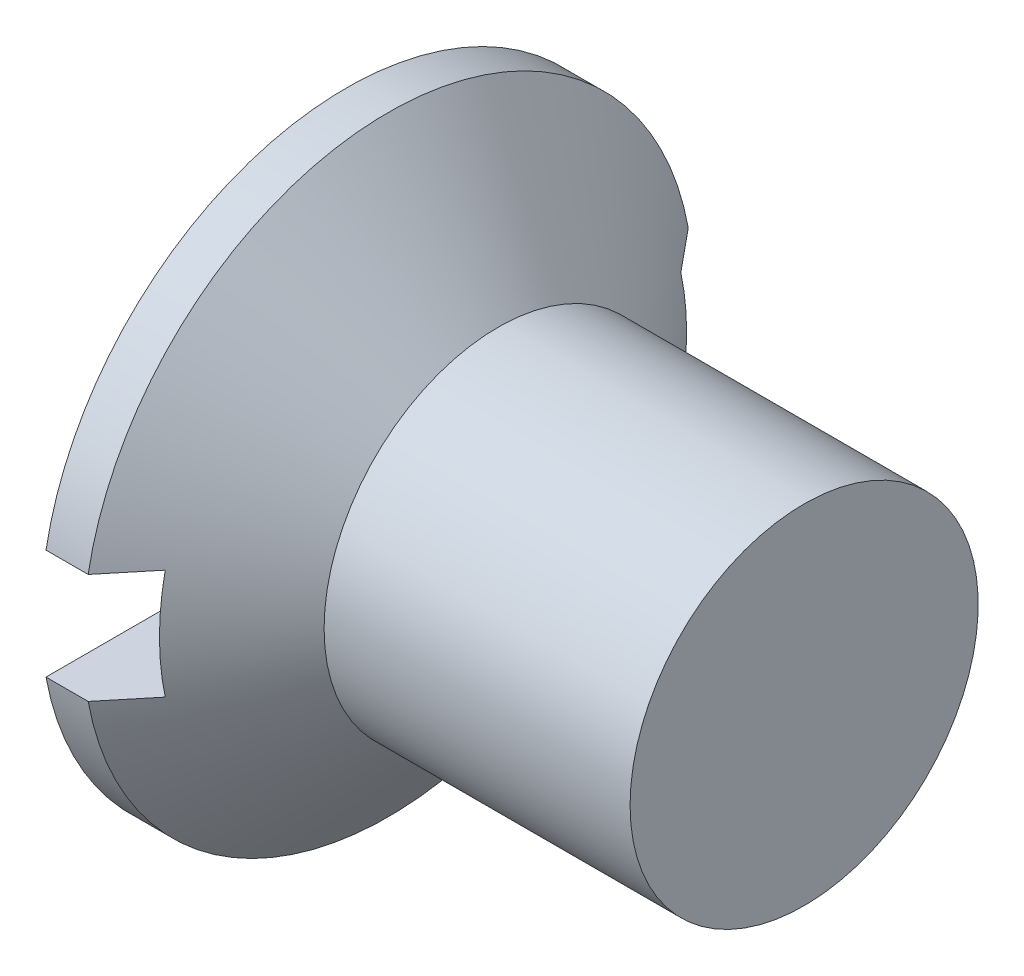
ISO-10303-21;
HEADER;
FILE_DESCRIPTION(('STEP AP214'),'2;1');
FILE_NAME('part.step','',(''),(''),'','','');
FILE_SCHEMA(('AUTOMOTIVE_DESIGN { 1 0 10303 214 1 1 1 1 }'));
ENDSEC;
DATA;
#1=APPLICATION_CONTEXT('core data for automotive mechanical design processes');
#2=APPLICATION_PROTOCOL_DEFINITION('international standard','automotive_design',2000,#1);
#3=PRODUCT_CONTEXT('',#1,'mechanical');
#4=PRODUCT('Part','Part','',(#3));
#5=PRODUCT_RELATED_PRODUCT_CATEGORY('part','',(#4));
#6=PRODUCT_DEFINITION_FORMATION('','',#4);
#7=PRODUCT_DEFINITION_CONTEXT('part definition',#1,'design');
#8=PRODUCT_DEFINITION('design','',#6,#7);
#9=PRODUCT_DEFINITION_SHAPE('','',#8);
#10=(LENGTH_UNIT() NAMED_UNIT(*) SI_UNIT(.MILLI.,.METRE.));
#11=(NAMED_UNIT(*) PLANE_ANGLE_UNIT() SI_UNIT($,.RADIAN.));
#12=(NAMED_UNIT(*) SI_UNIT($,.STERADIAN.) SOLID_ANGLE_UNIT());
#13=UNCERTAINTY_MEASURE_WITH_UNIT(LENGTH_MEASURE(1.E-05),#10,'distance_accuracy_value','');
#14=(GEOMETRIC_REPRESENTATION_CONTEXT(3) GLOBAL_UNCERTAINTY_ASSIGNED_CONTEXT((#13)) GLOBAL_UNIT_ASSIGNED_CONTEXT((#10,
#11,#12)) REPRESENTATION_CONTEXT('',''));
#15=CARTESIAN_POINT('',(0.,0.,0.));
#16=DIRECTION('',(0.,0.,1.));
#17=DIRECTION('',(1.,0.,0.));
#18=AXIS2_PLACEMENT_3D('',#15,#16,#17);
#19=CARTESIAN_POINT('',(1.0668,-0.762000000000001,-4.2291));
#20=DIRECTION('',(1.,0.,0.));
#21=DIRECTION('',(0.,0.,-1.));
#22=AXIS2_PLACEMENT_3D('',#19,#20,#21);
#23=PLANE('',#22);
#24=DIRECTION('',(0.,0.,1.));
#25=VECTOR('',#24,1.);
#26=CARTESIAN_POINT('',(1.0668,-0.457199999999986,-4.2291));
#27=LINE('',#26,#25);
#28=CARTESIAN_POINT('',(1.0668,-0.457200000000002,0.4572));
#29=VERTEX_POINT('',#28);
#30=CARTESIAN_POINT('',(1.0668,-0.457200000000007,2.11727142857143));
#31=VERTEX_POINT('',#30);
#32=EDGE_CURVE('E163',#29,#31,#27,.T.);
#33=ORIENTED_EDGE('',*,*,#32,.F.);
#34=DIRECTION('',(0.,1.,0.));
#35=VECTOR('',#34,1.);
#36=CARTESIAN_POINT('',(1.0668,-0.762,0.4572));
#37=LINE('',#36,#35);
#38=CARTESIAN_POINT('',(1.0668,-0.762000000000001,0.4572));
#39=VERTEX_POINT('',#38);
#40=EDGE_CURVE('E11',#39,#29,#37,.T.);
#41=ORIENTED_EDGE('',*,*,#40,.F.);
#42=DIRECTION('',(0.,0.,1.));
#43=VECTOR('',#42,1.);
#44=CARTESIAN_POINT('',(1.0668,-0.762000000000001,-4.2291));
#45=LINE('',#44,#43);
#46=CARTESIAN_POINT('',(1.0668,-0.762000000000001,3.57375793006765));
#47=VERTEX_POINT('',#46);
#48=EDGE_CURVE('E229',#39,#47,#45,.T.);
#49=ORIENTED_EDGE('',*,*,#48,.T.);
#50=CARTESIAN_POINT('',(1.0668,0.,0.));
#51=DIRECTION('',(1.,0.,0.));
#52=DIRECTION('',(0.,0.,-1.));
#53=AXIS2_PLACEMENT_3D('',#50,#51,#52);
#54=CIRCLE('',#53,3.65409219132761);
#55=CARTESIAN_POINT('',(1.0668,0.762,3.57375793006765));
#56=VERTEX_POINT('',#55);
#57=EDGE_CURVE('E265',#47,#56,#54,.F.);
#58=ORIENTED_EDGE('',*,*,#57,.T.);
#59=DIRECTION('',(0.,0.,-1.));
#60=VECTOR('',#59,1.);
#61=CARTESIAN_POINT('',(1.0668,0.762000000000001,4.2291));
#62=LINE('',#61,#60);
#63=CARTESIAN_POINT('',(1.0668,0.762000000000001,0.4572));
#64=VERTEX_POINT('',#63);
#65=EDGE_CURVE('E226',#56,#64,#62,.T.);
#66=ORIENTED_EDGE('',*,*,#65,.T.);
#67=CARTESIAN_POINT('',(1.0668,0.457199999999998,0.4572));
#68=VERTEX_POINT('',#67);
#69=EDGE_CURVE('E40',#68,#64,#37,.T.);
#70=ORIENTED_EDGE('',*,*,#69,.F.);
#71=DIRECTION('',(0.,0.,-1.));
#72=VECTOR('',#71,1.);
#73=CARTESIAN_POINT('',(1.0668,0.457200000000015,-4.2291));
#74=LINE('',#73,#72);
#75=CARTESIAN_POINT('',(1.0668,0.457199999999992,2.11727142857143));
#76=VERTEX_POINT('',#75);
#77=EDGE_CURVE('E371',#76,#68,#74,.T.);
#78=ORIENTED_EDGE('',*,*,#77,.F.);
#79=DIRECTION('',(0.,1.,0.));
#80=VECTOR('',#79,1.);
#81=CARTESIAN_POINT('',(1.0668,-0.762000000000023,2.11727142857143));
#82=LINE('',#81,#80);
#83=EDGE_CURVE('E315',#31,#76,#82,.T.);
#84=ORIENTED_EDGE('',*,*,#83,.F.);
#85=EDGE_LOOP('',(#33,#41,#49,#58,#66,#70,#78,#84));
#86=FACE_BOUND('',#85,.T.);
#87=ADVANCED_FACE('F32',(#86),#23,.F.);
#88=DIRECTION('',(0.,0.,1.));
#89=VECTOR('',#88,1.);
#90=CARTESIAN_POINT('',(1.0668,-0.457199999999986,-4.2291));
#91=LINE('',#90,#89);
#92=CARTESIAN_POINT('',(1.0668,-0.457199999999993,-2.11727142857143));
#93=VERTEX_POINT('',#92);
#94=CARTESIAN_POINT('',(1.0668,-0.457199999999999,-0.4572));
#95=VERTEX_POINT('',#94);
#96=EDGE_CURVE('E188',#93,#95,#91,.T.);
#97=ORIENTED_EDGE('',*,*,#96,.F.);
#98=DIRECTION('',(0.,-1.,0.));
#99=VECTOR('',#98,1.);
#100=CARTESIAN_POINT('',(1.0668,-0.762000000000008,-2.11727142857143));
#101=LINE('',#100,#99);
#102=CARTESIAN_POINT('',(1.0668,0.457200000000007,-2.11727142857143));
#103=VERTEX_POINT('',#102);
#104=EDGE_CURVE('E365',#103,#93,#101,.T.);
#105=ORIENTED_EDGE('',*,*,#104,.F.);
#106=DIRECTION('',(0.,0.,-1.));
#107=VECTOR('',#106,1.);
#108=CARTESIAN_POINT('',(1.0668,0.457200000000015,-4.2291));
#109=LINE('',#108,#107);
#110=CARTESIAN_POINT('',(1.0668,0.457200000000001,-0.4572));
#111=VERTEX_POINT('',#110);
#112=EDGE_CURVE('E376',#111,#103,#109,.T.);
#113=ORIENTED_EDGE('',*,*,#112,.F.);
#114=DIRECTION('',(0.,-1.,0.));
#115=VECTOR('',#114,1.);
#116=CARTESIAN_POINT('',(1.0668,-0.762000000000001,-0.4572));
#117=LINE('',#116,#115);
#118=CARTESIAN_POINT('',(1.0668,0.762,-0.4572));
#119=VERTEX_POINT('',#118);
#120=EDGE_CURVE('E346',#119,#111,#117,.T.);
#121=ORIENTED_EDGE('',*,*,#120,.F.);
#122=CARTESIAN_POINT('',(1.0668,0.762,-3.57375793006765));
#123=VERTEX_POINT('',#122);
#124=EDGE_CURVE('E54',#119,#123,#62,.T.);
#125=ORIENTED_EDGE('',*,*,#124,.T.);
#126=CARTESIAN_POINT('',(1.0668,-0.762000000000001,-3.57375793006765));
#127=VERTEX_POINT('',#126);
#128=EDGE_CURVE('E262',#123,#127,#54,.F.);
#129=ORIENTED_EDGE('',*,*,#128,.T.);
#130=CARTESIAN_POINT('',(1.0668,-0.762000000000001,-0.4572));
#131=VERTEX_POINT('',#130);
#132=EDGE_CURVE('E230',#127,#131,#45,.T.);
#133=ORIENTED_EDGE('',*,*,#132,.T.);
#134=EDGE_CURVE('E345',#95,#131,#117,.T.);
#135=ORIENTED_EDGE('',*,*,#134,.F.);
#136=EDGE_LOOP('',(#97,#105,#113,#121,#125,#129,#133,#135));
#137=FACE_BOUND('',#136,.T.);
#138=ADVANCED_FACE('F308',(#137),#23,.F.);
#139=CARTESIAN_POINT('',(4.11816176470588,0.,0.239245588235294));
#140=DIRECTION('',(-0.0712470499879096,0.,-0.997458699830735));
#141=DIRECTION('',(-0.997458699830735,0.,0.0712470499879097));
#142=AXIS2_PLACEMENT_3D('',#139,#140,#141);
#143=PLANE('',#142);
#144=ORIENTED_EDGE('',*,*,#40,.T.);
#145=DIRECTION('',(0.994936676326182,0.0710669054518704,-0.0710669054518702));
#146=VECTOR('',#145,1.);
#147=CARTESIAN_POINT('',(4.13507811942959,-0.238037277183602,0.238037277183601));
#148=LINE('',#147,#146);
#149=CARTESIAN_POINT('',(3.7338,-0.266700000000001,0.266699999999999));
#150=VERTEX_POINT('',#149);
#151=EDGE_CURVE('E161',#29,#150,#148,.T.);
#152=ORIENTED_EDGE('',*,*,#151,.T.);
#153=DIRECTION('',(0.820177018154054,0.569102420759956,-0.0585840727252897));
#154=VECTOR('',#153,1.);
#155=CARTESIAN_POINT('',(0.,-2.8575,0.533400000000001));
#156=LINE('',#155,#154);
#157=CARTESIAN_POINT('',(0.,-2.8575,0.533400000000001));
#158=VERTEX_POINT('',#157);
#159=EDGE_CURVE('E185',#158,#150,#156,.T.);
#160=ORIENTED_EDGE('',*,*,#159,.F.);
#161=DIRECTION('',(0.,-1.,0.));
#162=VECTOR('',#161,1.);
#163=CARTESIAN_POINT('',(0.,2.8575,0.5334));
#164=LINE('',#163,#162);
#165=CARTESIAN_POINT('',(0.,-0.762000000000001,0.5334));
#166=VERTEX_POINT('',#165);
#167=EDGE_CURVE('E322',#166,#158,#164,.T.);
#168=ORIENTED_EDGE('',*,*,#167,.F.);
#169=DIRECTION('',(0.997458699830735,0.,-0.0712470499879097));
#170=VECTOR('',#169,1.);
#171=CARTESIAN_POINT('',(1.39983654822335,-0.762000000000001,0.433411675126904));
#172=LINE('',#171,#170);
#173=EDGE_CURVE('E221',#166,#39,#172,.T.);
#174=ORIENTED_EDGE('',*,*,#173,.T.);
#175=EDGE_LOOP('',(#144,#152,#160,#168,#174));
#176=FACE_BOUND('',#175,.T.);
#177=ADVANCED_FACE('F183',(#176),#143,.T.);
#178=DIRECTION('',(0.820177018154054,-0.569102420759956,-0.0585840727252895));
#179=VECTOR('',#178,1.);
#180=CARTESIAN_POINT('',(0.,2.8575,0.5334));
#181=LINE('',#180,#179);
#182=CARTESIAN_POINT('',(0.,2.8575,0.5334));
#183=VERTEX_POINT('',#182);
#184=CARTESIAN_POINT('',(3.7338,0.2667,0.2667));
#185=VERTEX_POINT('',#184);
#186=EDGE_CURVE('E208',#183,#185,#181,.T.);
#187=ORIENTED_EDGE('',*,*,#186,.T.);
#188=DIRECTION('',(-0.994936676326182,0.0710669054518698,0.0710669054518701));
#189=VECTOR('',#188,1.);
#190=CARTESIAN_POINT('',(4.13507811942959,0.2380372771836,0.238037277183601));
#191=LINE('',#190,#189);
#192=EDGE_CURVE('E373',#185,#68,#191,.T.);
#193=ORIENTED_EDGE('',*,*,#192,.T.);
#194=ORIENTED_EDGE('',*,*,#69,.T.);
#195=DIRECTION('',(-0.997458699830735,0.,0.0712470499879097));
#196=VECTOR('',#195,1.);
#197=CARTESIAN_POINT('',(0.798746192893401,0.762,0.476346700507615));
#198=LINE('',#197,#196);
#199=CARTESIAN_POINT('',(0.,0.762,0.5334));
#200=VERTEX_POINT('',#199);
#201=EDGE_CURVE('E223',#64,#200,#198,.T.);
#202=ORIENTED_EDGE('',*,*,#201,.T.);
#203=EDGE_CURVE('E323',#183,#200,#164,.T.);
#204=ORIENTED_EDGE('',*,*,#203,.F.);
#205=EDGE_LOOP('',(#187,#193,#194,#202,#204));
#206=FACE_BOUND('',#205,.T.);
#207=ADVANCED_FACE('F409',(#206),#143,.T.);
#208=CARTESIAN_POINT('',(4.11816176470588,0.,-0.239245588235294));
#209=DIRECTION('',(-0.0712470499879095,0.,0.997458699830735));
#210=DIRECTION('',(0.997458699830735,0.,0.0712470499879095));
#211=AXIS2_PLACEMENT_3D('',#208,#209,#210);
#212=PLANE('',#211);
#213=DIRECTION('',(0.820177018154054,0.569102420759956,0.0585840727252895));
#214=VECTOR('',#213,1.);
#215=CARTESIAN_POINT('',(0.,-2.8575,-0.5334));
#216=LINE('',#215,#214);
#217=CARTESIAN_POINT('',(0.,-2.8575,-0.5334));
#218=VERTEX_POINT('',#217);
#219=CARTESIAN_POINT('',(3.7338,-0.2667,-0.2667));
#220=VERTEX_POINT('',#219);
#221=EDGE_CURVE('E203',#218,#220,#216,.T.);
#222=ORIENTED_EDGE('',*,*,#221,.T.);
#223=DIRECTION('',(-0.994936676326182,-0.0710669054518699,-0.07106690545187));
#224=VECTOR('',#223,1.);
#225=CARTESIAN_POINT('',(4.13507811942959,-0.2380372771836,-0.238037277183601));
#226=LINE('',#225,#224);
#227=EDGE_CURVE('E362',#220,#95,#226,.T.);
#228=ORIENTED_EDGE('',*,*,#227,.T.);
#229=ORIENTED_EDGE('',*,*,#134,.T.);
#230=DIRECTION('',(-0.997458699830735,0.,-0.0712470499879095));
#231=VECTOR('',#230,1.);
#232=CARTESIAN_POINT('',(0.798746192893401,-0.762000000000001,-0.476346700507614));
#233=LINE('',#232,#231);
#234=CARTESIAN_POINT('',(0.,-0.762000000000001,-0.5334));
#235=VERTEX_POINT('',#234);
#236=EDGE_CURVE('E218',#131,#235,#233,.T.);
#237=ORIENTED_EDGE('',*,*,#236,.T.);
#238=DIRECTION('',(0.,1.,0.));
#239=VECTOR('',#238,1.);
#240=CARTESIAN_POINT('',(0.,-2.8575,-0.5334));
#241=LINE('',#240,#239);
#242=EDGE_CURVE('E206',#218,#235,#241,.T.);
#243=ORIENTED_EDGE('',*,*,#242,.F.);
#244=EDGE_LOOP('',(#222,#228,#229,#237,#243));
#245=FACE_BOUND('',#244,.T.);
#246=ADVANCED_FACE('F359',(#245),#212,.T.);
#247=ORIENTED_EDGE('',*,*,#120,.T.);
#248=DIRECTION('',(0.994936676326182,-0.0710669054518703,0.07106690545187));
#249=VECTOR('',#248,1.);
#250=CARTESIAN_POINT('',(4.13507811942959,0.238037277183602,-0.238037277183601));
#251=LINE('',#250,#249);
#252=CARTESIAN_POINT('',(3.7338,0.266700000000001,-0.266699999999999));
#253=VERTEX_POINT('',#252);
#254=EDGE_CURVE('E378',#111,#253,#251,.T.);
#255=ORIENTED_EDGE('',*,*,#254,.T.);
#256=DIRECTION('',(0.820177018154054,-0.569102420759956,0.0585840727252895));
#257=VECTOR('',#256,1.);
#258=CARTESIAN_POINT('',(0.,2.8575,-0.533399999999999));
#259=LINE('',#258,#257);
#260=CARTESIAN_POINT('',(0.,2.8575,-0.533399999999999));
#261=VERTEX_POINT('',#260);
#262=EDGE_CURVE('E197',#261,#253,#259,.T.);
#263=ORIENTED_EDGE('',*,*,#262,.F.);
#264=CARTESIAN_POINT('',(0.,0.762,-0.5334));
#265=VERTEX_POINT('',#264);
#266=EDGE_CURVE('E202',#265,#261,#241,.T.);
#267=ORIENTED_EDGE('',*,*,#266,.F.);
#268=DIRECTION('',(0.997458699830735,0.,0.0712470499879095));
#269=VECTOR('',#268,1.);
#270=CARTESIAN_POINT('',(1.39983654822335,0.762,-0.433411675126903));
#271=LINE('',#270,#269);
#272=EDGE_CURVE('E47',#265,#119,#271,.T.);
#273=ORIENTED_EDGE('',*,*,#272,.T.);
#274=EDGE_LOOP('',(#247,#255,#263,#267,#273));
#275=FACE_BOUND('',#274,.T.);
#276=ADVANCED_FACE('F412',(#275),#212,.T.);
#277=CARTESIAN_POINT('',(0.,0.,0.));
#278=DIRECTION('',(-1.,0.,0.));
#279=DIRECTION('',(0.,0.,1.));
#280=AXIS2_PLACEMENT_3D('',#277,#278,#279);
#281=PLANE('',#280);
#282=DIRECTION('',(0.,0.,1.));
#283=VECTOR('',#282,1.);
#284=CARTESIAN_POINT('',(0.,2.8575,-0.533399999999999));
#285=LINE('',#284,#283);
#286=EDGE_CURVE('E319',#261,#183,#285,.T.);
#287=ORIENTED_EDGE('',*,*,#286,.T.);
#288=ORIENTED_EDGE('',*,*,#203,.T.);
#289=DIRECTION('',(0.,0.,-1.));
#290=VECTOR('',#289,1.);
#291=CARTESIAN_POINT('',(0.,0.762000000000001,4.2291));
#292=LINE('',#291,#290);
#293=CARTESIAN_POINT('',(0.,0.762000000000001,4.15988495153412));
#294=VERTEX_POINT('',#293);
#295=EDGE_CURVE('E234',#294,#200,#292,.T.);
#296=ORIENTED_EDGE('',*,*,#295,.F.);
#297=CARTESIAN_POINT('',(0.,0.,0.));
#298=DIRECTION('',(-1.,0.,0.));
#299=DIRECTION('',(0.,0.,1.));
#300=AXIS2_PLACEMENT_3D('',#297,#298,#299);
#301=CIRCLE('',#300,4.2291);
#302=CARTESIAN_POINT('',(0.,0.761999999999999,-4.15988495153412));
#303=VERTEX_POINT('',#302);
#304=EDGE_CURVE('E261',#294,#303,#301,.T.);
#305=ORIENTED_EDGE('',*,*,#304,.T.);
#306=EDGE_CURVE('E225',#265,#303,#292,.T.);
#307=ORIENTED_EDGE('',*,*,#306,.F.);
#308=ORIENTED_EDGE('',*,*,#266,.T.);
#309=EDGE_LOOP('',(#287,#288,#296,#305,#307,#308));
#310=FACE_BOUND('',#309,.T.);
#311=ADVANCED_FACE('F34',(#310),#281,.T.);
#312=DIRECTION('',(0.,0.,1.));
#313=VECTOR('',#312,1.);
#314=CARTESIAN_POINT('',(0.,-0.762000000000001,-4.2291));
#315=LINE('',#314,#313);
#316=CARTESIAN_POINT('',(0.,-0.762000000000001,4.15988495153412));
#317=VERTEX_POINT('',#316);
#318=EDGE_CURVE('E237',#166,#317,#315,.T.);
#319=ORIENTED_EDGE('',*,*,#318,.F.);
#320=ORIENTED_EDGE('',*,*,#167,.T.);
#321=DIRECTION('',(0.,0.,-1.));
#322=VECTOR('',#321,1.);
#323=CARTESIAN_POINT('',(0.,-2.8575,0.533400000000001));
#324=LINE('',#323,#322);
#325=EDGE_CURVE('E201',#158,#218,#324,.T.);
#326=ORIENTED_EDGE('',*,*,#325,.T.);
#327=ORIENTED_EDGE('',*,*,#242,.T.);
#328=CARTESIAN_POINT('',(0.,-0.762000000000001,-4.15988495153412));
#329=VERTEX_POINT('',#328);
#330=EDGE_CURVE('E238',#329,#235,#315,.T.);
#331=ORIENTED_EDGE('',*,*,#330,.F.);
#332=EDGE_CURVE('E258',#329,#317,#301,.T.);
#333=ORIENTED_EDGE('',*,*,#332,.T.);
#334=EDGE_LOOP('',(#319,#320,#326,#327,#331,#333));
#335=FACE_BOUND('',#334,.T.);
#336=ADVANCED_FACE('F293',(#335),#281,.T.);
#337=CARTESIAN_POINT('',(1.0668,0.762000000000001,4.2291));
#338=DIRECTION('',(0.,1.,0.));
#339=DIRECTION('',(0.,0.,1.));
#340=AXIS2_PLACEMENT_3D('',#337,#338,#339);
#341=PLANE('',#340);
#342=ORIENTED_EDGE('',*,*,#201,.F.);
#343=ORIENTED_EDGE('',*,*,#65,.F.);
#344=CARTESIAN_POINT('',(-3.7072587151079,0.761999999999999,-9.31247020957628));
#345=CARTESIAN_POINT('',(-3.44000396266747,0.761999999999999,-8.99289524940491));
#346=CARTESIAN_POINT('',(-3.17279503901657,0.761999999999999,-8.67328191067897));
#347=CARTESIAN_POINT('',(-2.63848754991508,0.761999999999999,-8.03388044084458));
#348=CARTESIAN_POINT('',(-2.37138900743357,0.761999999999999,-7.71409229054352));
#349=CARTESIAN_POINT('',(-1.83662954916673,0.761999999999999,-7.07341451995032));
#350=CARTESIAN_POINT('',(-1.56896924323154,0.761999999999999,-6.75252439056826));
#351=CARTESIAN_POINT('',(-1.03400782087754,0.761999999999999,-6.11052642944668));
#352=CARTESIAN_POINT('',(-0.766706656531127,0.761999999999999,-5.78941863766312));
#353=CARTESIAN_POINT('',(-0.351016482022428,0.761999999999999,-5.289228832191));
#354=CARTESIAN_POINT('',(-0.202447969195116,0.761999999999999,-5.11029601535559));
#355=CARTESIAN_POINT('',(0.0944702101105339,0.761999999999999,-4.75224397489555));
#356=CARTESIAN_POINT('',(0.242819873027035,0.761999999999999,-4.57312474831623));
#357=CARTESIAN_POINT('',(0.539280109274791,0.761999999999999,-4.21454388229939));
#358=CARTESIAN_POINT('',(0.687390533874603,0.761999999999999,-4.03508211986726));
#359=CARTESIAN_POINT('',(0.983148859629449,0.761999999999999,-3.6757952361082));
#360=CARTESIAN_POINT('',(1.1307967875803,0.762,-3.49597013686361));
#361=CARTESIAN_POINT('',(1.4250784460496,0.762,-3.1361172282448));
#362=CARTESIAN_POINT('',(1.57171364946036,0.762,-2.95609062361865));
#363=CARTESIAN_POINT('',(1.8638632061112,0.762,-2.5950604266825));
#364=CARTESIAN_POINT('',(2.00937730534471,0.762,-2.41405662790437));
#365=CARTESIAN_POINT('',(2.22594109536689,0.762,-2.14132570408114));
#366=CARTESIAN_POINT('',(2.29781283344027,0.762,-2.05025202846492));
#367=CARTESIAN_POINT('',(2.44075137093062,0.762,-1.8674759862933));
#368=CARTESIAN_POINT('',(2.51181818654625,0.762,-1.77577363244958));
#369=CARTESIAN_POINT('',(2.65270923783992,0.762,-1.59146944206522));
#370=CARTESIAN_POINT('',(2.72253390152458,0.762,-1.49886793303914));
#371=CARTESIAN_POINT('',(2.86023102306813,0.762,-1.31222787587146));
#372=CARTESIAN_POINT('',(2.92810378920395,0.762,-1.2181895582877));
#373=CARTESIAN_POINT('',(3.01025299873339,0.762,-1.09986139973731));
#374=CARTESIAN_POINT('',(3.02617193372397,0.762,-1.07671297039199));
#375=CARTESIAN_POINT('',(3.05776361668182,0.762,-1.03024803578523));
#376=CARTESIAN_POINT('',(3.07343635876401,0.762,-1.0069315265253));
#377=CARTESIAN_POINT('',(3.12003064533189,0.762,-0.936688717116781));
#378=CARTESIAN_POINT('',(3.15052357968402,0.762,-0.889475815608442));
#379=CARTESIAN_POINT('',(3.20988876697622,0.762,-0.79404861124143));
#380=CARTESIAN_POINT('',(3.23876139701169,0.762,-0.745834544993618));
#381=CARTESIAN_POINT('',(3.29412788302385,0.762,-0.648063743968882));
#382=CARTESIAN_POINT('',(3.32062251402159,0.762,-0.598507453545191));
#383=CARTESIAN_POINT('',(3.37465775114395,0.762,-0.488263349468389));
#384=CARTESIAN_POINT('',(3.40148165659019,0.762,-0.427215091921361));
#385=CARTESIAN_POINT('',(3.44672648840514,0.762,-0.302131811626183));
#386=CARTESIAN_POINT('',(3.46518411927974,0.762,-0.238111220787237));
#387=CARTESIAN_POINT('',(3.48225148127367,0.762,-0.146253405100647));
#388=CARTESIAN_POINT('',(3.48614457213765,0.762,-0.119389961654789));
#389=CARTESIAN_POINT('',(3.49159277555785,0.762,-0.0654330807399962));
#390=CARTESIAN_POINT('',(3.49314897484041,0.762,-0.038339756071416));
#391=CARTESIAN_POINT('',(3.49381884264939,0.762,0.0158555513881381));
#392=CARTESIAN_POINT('',(3.49293454383219,0.762,0.0429575081867973));
#393=CARTESIAN_POINT('',(3.48879300500414,0.762,0.0969771351854267));
#394=CARTESIAN_POINT('',(3.48553530776254,0.762,0.123894768867164));
#395=CARTESIAN_POINT('',(3.46943887741547,0.762,0.222717947790236));
#396=CARTESIAN_POINT('',(3.44971992546215,0.762,0.293536918063685));
#397=CARTESIAN_POINT('',(3.41248463748901,0.762,0.396952586176688));
#398=CARTESIAN_POINT('',(3.39872406524375,0.762,0.431090311747466));
#399=CARTESIAN_POINT('',(3.36925376548959,0.762,0.498521018044373));
#400=CARTESIAN_POINT('',(3.35354458588296,0.762,0.531814233069865));
#401=CARTESIAN_POINT('',(3.31943027054609,0.762,0.600099938588531));
#402=CARTESIAN_POINT('',(3.30091151200732,0.762,0.635034568538589));
#403=CARTESIAN_POINT('',(3.26259798542764,0.762,0.704200328292004));
#404=CARTESIAN_POINT('',(3.24280301670106,0.762,0.738431346329867));
#405=CARTESIAN_POINT('',(3.18195487065664,0.762,0.840317134774477));
#406=CARTESIAN_POINT('',(3.13946655069804,0.762,0.907110944423436));
#407=CARTESIAN_POINT('',(3.05209649049906,0.762,1.03933825791089));
#408=CARTESIAN_POINT('',(3.0072087743149,0.762,1.10476774173863));
#409=CARTESIAN_POINT('',(2.91593893123302,0.762,1.23458285009593));
#410=CARTESIAN_POINT('',(2.86955664404863,0.762,1.29896836154316));
#411=CARTESIAN_POINT('',(2.77564303598718,0.762,1.42719101494158));
#412=CARTESIAN_POINT('',(2.72810866938201,0.762,1.49102591502819));
#413=CARTESIAN_POINT('',(2.63231739037333,0.762,1.61816085659659));
#414=CARTESIAN_POINT('',(2.58406040114766,0.762,1.68146084007611));
#415=CARTESIAN_POINT('',(2.48711166195508,0.762,1.80754005925795));
#416=CARTESIAN_POINT('',(2.4384208812433,0.762,1.8703200416005));
#417=CARTESIAN_POINT('',(2.34064642193829,0.762,1.99556913314589));
#418=CARTESIAN_POINT('',(2.2915627582342,0.762,2.05803825398535));
#419=CARTESIAN_POINT('',(2.14505428390598,0.762,2.24357793079312));
#420=CARTESIAN_POINT('',(2.04719301404901,0.762,2.36630365837331));
#421=CARTESIAN_POINT('',(1.8507288300365,0.762,2.61116041822068));
#422=CARTESIAN_POINT('',(1.75212590845148,0.762,2.73329144451022));
#423=CARTESIAN_POINT('',(1.45557279612036,0.762,3.09909678290094));
#424=CARTESIAN_POINT('',(1.2568860666964,0.762,3.34217356184719));
#425=CARTESIAN_POINT('',(0.858371778839216,0.762,3.82769147746165));
#426=CARTESIAN_POINT('',(0.658543479199191,0.762000000000001,4.07013200381217));
#427=CARTESIAN_POINT('',(0.258296994462048,0.762000000000001,4.55451731374327));
#428=CARTESIAN_POINT('',(0.0578788214805035,0.762000000000001,4.79646210733509));
#429=CARTESIAN_POINT('',(-0.342651084604213,0.762000000000001,5.27922139320987));
#430=CARTESIAN_POINT('',(-0.542761552217687,0.762000000000001,5.52003693622951));
#431=CARTESIAN_POINT('',(-0.943235771199072,0.762000000000001,6.0014594705858));
#432=CARTESIAN_POINT('',(-1.14359952391292,0.762000000000001,6.24206646080266));
#433=CARTESIAN_POINT('',(-1.74487446681376,0.762000000000001,6.96357581031943));
#434=CARTESIAN_POINT('',(-2.14604716610217,0.762000000000001,7.44426021090038));
#435=CARTESIAN_POINT('',(-2.64396767488127,0.762000000000001,8.04039269149122));
#436=CARTESIAN_POINT('',(-2.74053815988001,0.762000000000001,8.15598900298721));
#437=CARTESIAN_POINT('',(-2.93370243828661,0.762000000000001,8.38716828573998));
#438=CARTESIAN_POINT('',(-3.03029623232835,0.762000000000001,8.50275125646724));
#439=CARTESIAN_POINT('',(-3.22361055923857,0.762000000000001,8.73403297481519));
#440=CARTESIAN_POINT('',(-3.3203311120419,0.762000000000001,8.84973170577214));
#441=CARTESIAN_POINT('',(-3.51378501887363,0.762000000000001,9.08111230907534));
#442=CARTESIAN_POINT('',(-3.61051837240627,0.762000000000001,9.19679418183607));
#443=CARTESIAN_POINT('',(-3.7072587151079,0.762000000000001,9.31247020957628));
#444=B_SPLINE_CURVE_WITH_KNOTS('',3,(#344,#345,#346,#347,#348,#349,#350,#351,#352,#353,#354,
#355,#356,#357,#358,#359,#360,#361,#362,#363,#364,#365,#366,#367,#368,#369,#370,#371,#372,#373,
#374,#375,#376,#377,#378,#379,#380,#381,#382,#383,#384,#385,#386,#387,#388,#389,#390,#391,#392,
#393,#394,#395,#396,#397,#398,#399,#400,#401,#402,#403,#404,#405,#406,#407,#408,#409,#410,#411,
#412,#413,#414,#415,#416,#417,#418,#419,#420,#421,#422,#423,#424,#425,#426,#427,#428,#429,#430,
#431,#432,#433,#434,#435,#436,#437,#438,#439,#440,#441,#442,#443),.UNSPECIFIED.,.F.,.F.,(4,2,2,
2,2,2,2,2,2,2,2,2,2,2,2,2,2,2,2,2,2,2,2,2,2,2,2,2,2,2,2,2,2,2,2,2,2,2,2,2,2,2,2,2,2,2,2,2,2,4),
(0.,1.24979177055031,2.49977364678617,3.75337340915538,5.00678480989464,5.70449953641302,
6.40222549582503,7.10028597713672,7.79830523757462,8.49486886607833,9.19158592801292,
9.53963455495035,9.88767616508718,10.2355954326881,10.5834594457616,10.6677394347889,
10.7520214354215,10.9206098842186,11.0891589331044,11.2576528486494,11.4573840058406,
11.6562302139656,11.7375735487706,11.8188790447009,11.9001168428741,11.9813702954963,
12.2003589763496,12.3107660706915,12.4211421912431,12.5397301834959,12.6583368695601,
12.8957317314617,13.1337482222774,13.3717903249131,13.6105509507334,13.8493371420336,
14.0876816613435,14.3260171904438,14.7969108454091,15.2678092238338,16.2096435543133,
17.1521812972522,18.0946998143895,19.0340222130937,19.9733496244529,21.8516391210576,
22.3035188577441,22.7554127102839,23.207816903612,23.6602069291595),.UNSPECIFIED.);
#445=CARTESIAN_POINT('',(0.584311159818935,0.762000000000001,4.15988495153414));
#446=VERTEX_POINT('',#445);
#447=EDGE_CURVE('E339',#56,#446,#444,.T.);
#448=ORIENTED_EDGE('',*,*,#447,.T.);
#449=DIRECTION('',(-1.,0.,0.));
#450=VECTOR('',#449,1.);
#451=CARTESIAN_POINT('',(-6.34999999999999,0.762000000000001,4.15988495153412));
#452=LINE('',#451,#450);
#453=EDGE_CURVE('E244',#446,#294,#452,.T.);
#454=ORIENTED_EDGE('',*,*,#453,.T.);
#455=ORIENTED_EDGE('',*,*,#295,.T.);
#456=EDGE_LOOP('',(#342,#343,#448,#454,#455));
#457=FACE_BOUND('',#456,.T.);
#458=ADVANCED_FACE('F289',(#457),#341,.F.);
#459=ORIENTED_EDGE('',*,*,#272,.F.);
#460=ORIENTED_EDGE('',*,*,#306,.T.);
#461=DIRECTION('',(-1.,0.,0.));
#462=VECTOR('',#461,1.);
#463=CARTESIAN_POINT('',(-6.34999999999999,0.761999999999999,-4.15988495153412));
#464=LINE('',#463,#462);
#465=CARTESIAN_POINT('',(0.584311159818947,0.761999999999999,-4.15988495153412));
#466=VERTEX_POINT('',#465);
#467=EDGE_CURVE('E246',#303,#466,#464,.F.);
#468=ORIENTED_EDGE('',*,*,#467,.T.);
#469=EDGE_CURVE('E272',#466,#123,#444,.T.);
#470=ORIENTED_EDGE('',*,*,#469,.T.);
#471=ORIENTED_EDGE('',*,*,#124,.F.);
#472=EDGE_LOOP('',(#459,#460,#468,#470,#471));
#473=FACE_BOUND('',#472,.T.);
#474=ADVANCED_FACE('F286',(#473),#341,.F.);
#475=CARTESIAN_POINT('',(1.0668,-0.762000000000001,-4.2291));
#476=DIRECTION('',(0.,-1.,0.));
#477=DIRECTION('',(0.,0.,-1.));
#478=AXIS2_PLACEMENT_3D('',#475,#476,#477);
#479=PLANE('',#478);
#480=ORIENTED_EDGE('',*,*,#173,.F.);
#481=ORIENTED_EDGE('',*,*,#318,.T.);
#482=DIRECTION('',(-1.,0.,0.));
#483=VECTOR('',#482,1.);
#484=CARTESIAN_POINT('',(-6.34999999999999,-0.762000000000001,4.15988495153412));
#485=LINE('',#484,#483);
#486=CARTESIAN_POINT('',(0.584311159818947,-0.762000000000001,4.15988495153412));
#487=VERTEX_POINT('',#486);
#488=EDGE_CURVE('E242',#317,#487,#485,.F.);
#489=ORIENTED_EDGE('',*,*,#488,.T.);
#490=CARTESIAN_POINT('',(-3.7072587151079,-0.762,9.31247020957628));
#491=CARTESIAN_POINT('',(-3.44000396266747,-0.762,8.99289524940492));
#492=CARTESIAN_POINT('',(-3.17279503901657,-0.762,8.67328191067897));
#493=CARTESIAN_POINT('',(-2.63848754991508,-0.762,8.03388044084459));
#494=CARTESIAN_POINT('',(-2.37138900743358,-0.762,7.71409229054353));
#495=CARTESIAN_POINT('',(-1.83662954916675,-0.762,7.07341451995033));
#496=CARTESIAN_POINT('',(-1.56896924323155,-0.762,6.75252439056828));
#497=CARTESIAN_POINT('',(-1.03400782087756,-0.762,6.1105264294467));
#498=CARTESIAN_POINT('',(-0.766706656531148,-0.762000000000001,5.78941863766314));
#499=CARTESIAN_POINT('',(-0.351016482022452,-0.762000000000001,5.28922883219103));
#500=CARTESIAN_POINT('',(-0.202447969195138,-0.762000000000001,5.11029601535562));
#501=CARTESIAN_POINT('',(0.0944702101105142,-0.762000000000001,4.75224397489557));
#502=CARTESIAN_POINT('',(0.242819873027016,-0.762000000000001,4.57312474831625));
#503=CARTESIAN_POINT('',(0.539280109274774,-0.762000000000001,4.21454388229941));
#504=CARTESIAN_POINT('',(0.687390533874587,-0.762000000000001,4.03508211986728));
#505=CARTESIAN_POINT('',(0.983148859629435,-0.762000000000001,3.67579523610822));
#506=CARTESIAN_POINT('',(1.13079678758029,-0.762000000000001,3.49597013686362));
#507=CARTESIAN_POINT('',(1.42507844604959,-0.762000000000001,3.13611722824482));
#508=CARTESIAN_POINT('',(1.57171364946035,-0.762000000000001,2.95609062361866));
#509=CARTESIAN_POINT('',(1.86386320611119,-0.762000000000001,2.59506042668251));
#510=CARTESIAN_POINT('',(2.0093773053447,-0.762,2.41405662790438));
#511=CARTESIAN_POINT('',(2.22594109536688,-0.762000000000001,2.14132570408115));
#512=CARTESIAN_POINT('',(2.29781283344027,-0.762000000000001,2.05025202846493));
#513=CARTESIAN_POINT('',(2.44075137093061,-0.762000000000001,1.86747598629331));
#514=CARTESIAN_POINT('',(2.51181818654625,-0.762000000000001,1.77577363244959));
#515=CARTESIAN_POINT('',(2.65270923783991,-0.762000000000001,1.59146944206522));
#516=CARTESIAN_POINT('',(2.72253390152457,-0.762000000000001,1.49886793303915));
#517=CARTESIAN_POINT('',(2.86023102306813,-0.762000000000001,1.31222787587147));
#518=CARTESIAN_POINT('',(2.92810378920395,-0.762000000000001,1.2181895582877));
#519=CARTESIAN_POINT('',(3.01025299873339,-0.762000000000001,1.09986139973731));
#520=CARTESIAN_POINT('',(3.02617193372397,-0.762000000000001,1.07671297039199));
#521=CARTESIAN_POINT('',(3.05776361668182,-0.762000000000001,1.03024803578523));
#522=CARTESIAN_POINT('',(3.07343635876401,-0.762000000000001,1.00693152652531));
#523=CARTESIAN_POINT('',(3.12003064533189,-0.762000000000001,0.936688717116782));
#524=CARTESIAN_POINT('',(3.15052357968402,-0.762000000000001,0.889475815608443));
#525=CARTESIAN_POINT('',(3.20988876697622,-0.762000000000001,0.79404861124143));
#526=CARTESIAN_POINT('',(3.23876139701169,-0.762000000000001,0.745834544993617));
#527=CARTESIAN_POINT('',(3.29412788302385,-0.762000000000001,0.648063743968881));
#528=CARTESIAN_POINT('',(3.32062251402159,-0.762000000000001,0.59850745354519));
#529=CARTESIAN_POINT('',(3.37465775114395,-0.762000000000001,0.488263349468388));
#530=CARTESIAN_POINT('',(3.40148165659019,-0.762000000000001,0.427215091921361));
#531=CARTESIAN_POINT('',(3.44672648840514,-0.762000000000001,0.302131811626183));
#532=CARTESIAN_POINT('',(3.46518411927974,-0.762000000000001,0.238111220787237));
#533=CARTESIAN_POINT('',(3.48225148127367,-0.762000000000001,0.146253405100646));
#534=CARTESIAN_POINT('',(3.48614457213765,-0.762000000000001,0.119389961654789));
#535=CARTESIAN_POINT('',(3.49159277555785,-0.762000000000001,0.0654330807399958));
#536=CARTESIAN_POINT('',(3.49314897484041,-0.762000000000001,0.0383397560714156));
#537=CARTESIAN_POINT('',(3.49381884264939,-0.762000000000001,-0.0158555513881384));
#538=CARTESIAN_POINT('',(3.49293454383219,-0.762000000000001,-0.0429575081867975));
#539=CARTESIAN_POINT('',(3.48879300500414,-0.762000000000001,-0.096977135185427));
#540=CARTESIAN_POINT('',(3.48553530776253,-0.762000000000001,-0.123894768867164));
#541=CARTESIAN_POINT('',(3.46943887741547,-0.762000000000001,-0.222717947790237));
#542=CARTESIAN_POINT('',(3.44971992546215,-0.762000000000001,-0.293536918063686));
#543=CARTESIAN_POINT('',(3.41248463748901,-0.762000000000001,-0.396952586176688));
#544=CARTESIAN_POINT('',(3.39872406524375,-0.762000000000001,-0.431090311747467));
#545=CARTESIAN_POINT('',(3.36925376548959,-0.762000000000001,-0.498521018044374));
#546=CARTESIAN_POINT('',(3.35354458588296,-0.762000000000001,-0.531814233069866));
#547=CARTESIAN_POINT('',(3.31943027054609,-0.762000000000001,-0.600099938588531));
#548=CARTESIAN_POINT('',(3.30091151200732,-0.762000000000001,-0.63503456853859));
#549=CARTESIAN_POINT('',(3.26259798542763,-0.762000000000001,-0.704200328292004));
#550=CARTESIAN_POINT('',(3.24280301670106,-0.762000000000001,-0.738431346329867));
#551=CARTESIAN_POINT('',(3.18195487065664,-0.762000000000001,-0.840317134774478));
#552=CARTESIAN_POINT('',(3.13946655069804,-0.762000000000001,-0.907110944423437));
#553=CARTESIAN_POINT('',(3.05209649049906,-0.762000000000001,-1.03933825791089));
#554=CARTESIAN_POINT('',(3.0072087743149,-0.762000000000001,-1.10476774173863));
#555=CARTESIAN_POINT('',(2.91593893123301,-0.762000000000001,-1.23458285009593));
#556=CARTESIAN_POINT('',(2.86955664404862,-0.762000000000001,-1.29896836154316));
#557=CARTESIAN_POINT('',(2.77564303598718,-0.762000000000001,-1.42719101494158));
#558=CARTESIAN_POINT('',(2.72810866938201,-0.762000000000001,-1.49102591502819));
#559=CARTESIAN_POINT('',(2.63231739037333,-0.762000000000001,-1.6181608565966));
#560=CARTESIAN_POINT('',(2.58406040114766,-0.762000000000001,-1.68146084007611));
#561=CARTESIAN_POINT('',(2.48711166195508,-0.762000000000001,-1.80754005925795));
#562=CARTESIAN_POINT('',(2.4384208812433,-0.762000000000001,-1.87032004160051));
#563=CARTESIAN_POINT('',(2.34064642193829,-0.762000000000001,-1.9955691331459));
#564=CARTESIAN_POINT('',(2.2915627582342,-0.762000000000001,-2.05803825398535));
#565=CARTESIAN_POINT('',(2.14505428390597,-0.762000000000001,-2.24357793079312));
#566=CARTESIAN_POINT('',(2.04719301404901,-0.762000000000001,-2.36630365837331));
#567=CARTESIAN_POINT('',(1.85072883003649,-0.762000000000001,-2.61116041822068));
#568=CARTESIAN_POINT('',(1.75212590845148,-0.762000000000001,-2.73329144451023));
#569=CARTESIAN_POINT('',(1.45557279612036,-0.762000000000001,-3.09909678290095));
#570=CARTESIAN_POINT('',(1.25688606669639,-0.762000000000001,-3.34217356184719));
#571=CARTESIAN_POINT('',(0.85837177883921,-0.762000000000001,-3.82769147746166));
#572=CARTESIAN_POINT('',(0.658543479199185,-0.762000000000001,-4.07013200381218));
#573=CARTESIAN_POINT('',(0.258296994462042,-0.762000000000001,-4.55451731374328));
#574=CARTESIAN_POINT('',(0.0578788214804977,-0.762000000000001,-4.7964621073351));
#575=CARTESIAN_POINT('',(-0.34265108460422,-0.762000000000001,-5.27922139320988));
#576=CARTESIAN_POINT('',(-0.542761552217694,-0.762000000000001,-5.52003693622952));
#577=CARTESIAN_POINT('',(-0.943235771199079,-0.762000000000001,-6.00145947058581));
#578=CARTESIAN_POINT('',(-1.14359952391293,-0.762000000000001,-6.24206646080267));
#579=CARTESIAN_POINT('',(-1.74487446681377,-0.762000000000001,-6.96357581031944));
#580=CARTESIAN_POINT('',(-2.14604716610218,-0.762000000000001,-7.44426021090039));
#581=CARTESIAN_POINT('',(-2.64396767488128,-0.762000000000001,-8.04039269149123));
#582=CARTESIAN_POINT('',(-2.74053815988002,-0.762000000000001,-8.15598900298722));
#583=CARTESIAN_POINT('',(-2.93370243828662,-0.762000000000001,-8.38716828573999));
#584=CARTESIAN_POINT('',(-3.03029623232836,-0.762000000000001,-8.50275125646725));
#585=CARTESIAN_POINT('',(-3.22361055923857,-0.762000000000001,-8.7340329748152));
#586=CARTESIAN_POINT('',(-3.32033111204191,-0.762000000000001,-8.84973170577215));
#587=CARTESIAN_POINT('',(-3.51378501887363,-0.762000000000001,-9.08111230907534));
#588=CARTESIAN_POINT('',(-3.61051837240627,-0.762000000000001,-9.19679418183607));
#589=CARTESIAN_POINT('',(-3.7072587151079,-0.762000000000001,-9.31247020957628));
#590=B_SPLINE_CURVE_WITH_KNOTS('',3,(#490,#491,#492,#493,#494,#495,#496,#497,#498,#499,#500,
#501,#502,#503,#504,#505,#506,#507,#508,#509,#510,#511,#512,#513,#514,#515,#516,#517,#518,#519,
#520,#521,#522,#523,#524,#525,#526,#527,#528,#529,#530,#531,#532,#533,#534,#535,#536,#537,#538,
#539,#540,#541,#542,#543,#544,#545,#546,#547,#548,#549,#550,#551,#552,#553,#554,#555,#556,#557,
#558,#559,#560,#561,#562,#563,#564,#565,#566,#567,#568,#569,#570,#571,#572,#573,#574,#575,#576,
#577,#578,#579,#580,#581,#582,#583,#584,#585,#586,#587,#588,#589),.UNSPECIFIED.,.F.,.F.,(4,2,2,
2,2,2,2,2,2,2,2,2,2,2,2,2,2,2,2,2,2,2,2,2,2,2,2,2,2,2,2,2,2,2,2,2,2,2,2,2,2,2,2,2,2,2,2,2,2,4),
(0.,1.2497917705503,2.49977364678615,3.75337340915535,5.0067848098946,5.70449953641299,
6.402225495825,7.10028597713669,7.7983052375746,8.49486886607831,9.19158592801291,
9.53963455495034,9.88767616508717,10.2355954326881,10.5834594457616,10.6677394347889,
10.7520214354215,10.9206098842186,11.0891589331044,11.2576528486493,11.4573840058406,
11.6562302139656,11.7375735487706,11.8188790447009,11.9001168428741,11.9813702954963,
12.2003589763496,12.3107660706915,12.4211421912431,12.5397301834959,12.65833686956,
12.8957317314617,13.1337482222774,13.3717903249131,13.6105509507334,13.8493371420336,
14.0876816613435,14.3260171904438,14.7969108454091,15.2678092238338,16.2096435543133,
17.1521812972522,18.0946998143895,19.0340222130937,19.9733496244529,21.8516391210576,
22.3035188577441,22.7554127102839,23.207816903612,23.6602069291595),.UNSPECIFIED.);
#591=EDGE_CURVE('E273',#487,#47,#590,.T.);
#592=ORIENTED_EDGE('',*,*,#591,.T.);
#593=ORIENTED_EDGE('',*,*,#48,.F.);
#594=EDGE_LOOP('',(#480,#481,#489,#592,#593));
#595=FACE_BOUND('',#594,.T.);
#596=ADVANCED_FACE('F281',(#595),#479,.F.);
#597=ORIENTED_EDGE('',*,*,#236,.F.);
#598=ORIENTED_EDGE('',*,*,#132,.F.);
#599=CARTESIAN_POINT('',(0.584311159818935,-0.762000000000001,-4.15988495153414));
#600=VERTEX_POINT('',#599);
#601=EDGE_CURVE('E264',#127,#600,#590,.T.);
#602=ORIENTED_EDGE('',*,*,#601,.T.);
#603=DIRECTION('',(-1.,0.,0.));
#604=VECTOR('',#603,1.);
#605=CARTESIAN_POINT('',(-6.34999999999999,-0.762000000000001,-4.15988495153412));
#606=LINE('',#605,#604);
#607=EDGE_CURVE('E233',#600,#329,#606,.T.);
#608=ORIENTED_EDGE('',*,*,#607,.T.);
#609=ORIENTED_EDGE('',*,*,#330,.T.);
#610=EDGE_LOOP('',(#597,#598,#602,#608,#609));
#611=FACE_BOUND('',#610,.T.);
#612=ADVANCED_FACE('F285',(#611),#479,.F.);
#613=CARTESIAN_POINT('',(-6.34999999999999,0.,0.));
#614=DIRECTION('',(-1.,0.,0.));
#615=DIRECTION('',(0.,0.,1.));
#616=AXIS2_PLACEMENT_3D('',#613,#614,#615);
#617=CYLINDRICAL_SURFACE('',#616,4.2291);
#618=ORIENTED_EDGE('',*,*,#467,.F.);
#619=ORIENTED_EDGE('',*,*,#304,.F.);
#620=ORIENTED_EDGE('',*,*,#453,.F.);
#621=CARTESIAN_POINT('',(0.584311159818947,0.,0.));
#622=DIRECTION('',(-1.,0.,0.));
#623=DIRECTION('',(0.,0.,1.));
#624=AXIS2_PLACEMENT_3D('',#621,#622,#623);
#625=CIRCLE('',#624,4.2291);
#626=EDGE_CURVE('E257',#446,#466,#625,.T.);
#627=ORIENTED_EDGE('',*,*,#626,.T.);
#628=EDGE_LOOP('',(#618,#619,#620,#627));
#629=FACE_BOUND('',#628,.T.);
#630=ADVANCED_FACE('F472',(#629),#617,.T.);
#631=ORIENTED_EDGE('',*,*,#488,.F.);
#632=ORIENTED_EDGE('',*,*,#332,.F.);
#633=ORIENTED_EDGE('',*,*,#607,.F.);
#634=EDGE_CURVE('E254',#600,#487,#625,.T.);
#635=ORIENTED_EDGE('',*,*,#634,.T.);
#636=EDGE_LOOP('',(#631,#632,#633,#635));
#637=FACE_BOUND('',#636,.T.);
#638=ADVANCED_FACE('F304',(#637),#617,.T.);
#639=CARTESIAN_POINT('',(0.584311159818947,0.,0.));
#640=DIRECTION('',(-1.,0.,0.));
#641=DIRECTION('',(0.,0.,1.));
#642=AXIS2_PLACEMENT_3D('',#639,#640,#641);
#643=CONICAL_SURFACE('',#642,4.2291,0.872664625997166);
#644=ORIENTED_EDGE('',*,*,#447,.F.);
#645=ORIENTED_EDGE('',*,*,#57,.F.);
#646=ORIENTED_EDGE('',*,*,#591,.F.);
#647=ORIENTED_EDGE('',*,*,#634,.F.);
#648=ORIENTED_EDGE('',*,*,#601,.F.);
#649=ORIENTED_EDGE('',*,*,#128,.F.);
#650=ORIENTED_EDGE('',*,*,#469,.F.);
#651=ORIENTED_EDGE('',*,*,#626,.F.);
#652=EDGE_LOOP('',(#644,#645,#646,#647,#648,#649,#650,#651));
#653=FACE_BOUND('',#652,.T.);
#654=CARTESIAN_POINT('',(2.1082,0.,0.));
#655=DIRECTION('',(-1.,0.,0.));
#656=DIRECTION('',(0.,0.,1.));
#657=AXIS2_PLACEMENT_3D('',#654,#655,#656);
#658=CIRCLE('',#657,2.413);
#659=CARTESIAN_POINT('',(2.1082,0.,2.413));
#660=VERTEX_POINT('',#659);
#661=EDGE_CURVE('E251',#660,#660,#658,.T.);
#662=ORIENTED_EDGE('',*,*,#661,.T.);
#663=EDGE_LOOP('',(#662));
#664=FACE_BOUND('',#663,.T.);
#665=ADVANCED_FACE('F278',(#653,#664),#643,.T.);
#666=CARTESIAN_POINT('',(-6.34999999999999,0.,0.));
#667=DIRECTION('',(-1.,0.,0.));
#668=DIRECTION('',(0.,0.,1.));
#669=AXIS2_PLACEMENT_3D('',#666,#667,#668);
#670=CYLINDRICAL_SURFACE('',#669,2.413);
#671=CARTESIAN_POINT('',(6.35,0.,0.));
#672=DIRECTION('',(-1.,0.,0.));
#673=DIRECTION('',(0.,0.,1.));
#674=AXIS2_PLACEMENT_3D('',#671,#672,#673);
#675=CIRCLE('',#674,2.413);
#676=CARTESIAN_POINT('',(6.35,0.,2.413));
#677=VERTEX_POINT('',#676);
#678=EDGE_CURVE('E248',#677,#677,#675,.T.);
#679=ORIENTED_EDGE('',*,*,#678,.T.);
#680=EDGE_LOOP('',(#679));
#681=FACE_BOUND('',#680,.T.);
#682=ORIENTED_EDGE('',*,*,#661,.F.);
#683=EDGE_LOOP('',(#682));
#684=FACE_BOUND('',#683,.T.);
#685=ADVANCED_FACE('F297',(#681,#684),#670,.T.);
#686=CARTESIAN_POINT('',(6.35,2.413,0.));
#687=DIRECTION('',(1.,0.,0.));
#688=DIRECTION('',(0.,0.,-1.));
#689=AXIS2_PLACEMENT_3D('',#686,#687,#688);
#690=PLANE('',#689);
#691=ORIENTED_EDGE('',*,*,#678,.F.);
#692=EDGE_LOOP('',(#691));
#693=FACE_BOUND('',#692,.T.);
#694=ADVANCED_FACE('F295',(#693),#690,.T.);
#695=CARTESIAN_POINT('',(3.7338,0.2667,-0.2667));
#696=DIRECTION('',(1.,0.,0.));
#697=DIRECTION('',(0.,0.,-1.));
#698=AXIS2_PLACEMENT_3D('',#695,#696,#697);
#699=PLANE('',#698);
#700=DIRECTION('',(0.,1.,0.));
#701=VECTOR('',#700,1.);
#702=CARTESIAN_POINT('',(3.7338,-0.2667,-0.2667));
#703=LINE('',#702,#701);
#704=EDGE_CURVE('E194',#220,#253,#703,.T.);
#705=ORIENTED_EDGE('',*,*,#704,.F.);
#706=DIRECTION('',(0.,0.,-1.));
#707=VECTOR('',#706,1.);
#708=CARTESIAN_POINT('',(3.7338,-0.2667,0.2667));
#709=LINE('',#708,#707);
#710=EDGE_CURVE('E178',#150,#220,#709,.T.);
#711=ORIENTED_EDGE('',*,*,#710,.F.);
#712=DIRECTION('',(0.,-1.,0.));
#713=VECTOR('',#712,1.);
#714=CARTESIAN_POINT('',(3.7338,0.2667,0.2667));
#715=LINE('',#714,#713);
#716=EDGE_CURVE('E170',#185,#150,#715,.T.);
#717=ORIENTED_EDGE('',*,*,#716,.F.);
#718=DIRECTION('',(0.,0.,1.));
#719=VECTOR('',#718,1.);
#720=CARTESIAN_POINT('',(3.7338,0.2667,-0.2667));
#721=LINE('',#720,#719);
#722=EDGE_CURVE('E179',#253,#185,#721,.T.);
#723=ORIENTED_EDGE('',*,*,#722,.F.);
#724=EDGE_LOOP('',(#705,#711,#717,#723));
#725=FACE_BOUND('',#724,.T.);
#726=ADVANCED_FACE('F192',(#725),#699,.F.);
#727=CARTESIAN_POINT('',(0.,-2.8575,-0.5334));
#728=DIRECTION('',(-0.570081548206294,0.821588113591424,0.));
#729=DIRECTION('',(-0.821588113591424,-0.570081548206294,0.));
#730=AXIS2_PLACEMENT_3D('',#727,#728,#729);
#731=PLANE('',#730);
#732=ORIENTED_EDGE('',*,*,#221,.F.);
#733=ORIENTED_EDGE('',*,*,#325,.F.);
#734=ORIENTED_EDGE('',*,*,#159,.T.);
#735=ORIENTED_EDGE('',*,*,#710,.T.);
#736=EDGE_LOOP('',(#732,#733,#734,#735));
#737=FACE_BOUND('',#736,.T.);
#738=ADVANCED_FACE('F199',(#737),#731,.T.);
#739=CARTESIAN_POINT('',(3.7338,0.2667,0.2667));
#740=DIRECTION('',(-0.570081548206294,-0.821588113591424,0.));
#741=DIRECTION('',(0.821588113591424,-0.570081548206294,0.));
#742=AXIS2_PLACEMENT_3D('',#739,#740,#741);
#743=PLANE('',#742);
#744=ORIENTED_EDGE('',*,*,#186,.F.);
#745=ORIENTED_EDGE('',*,*,#286,.F.);
#746=ORIENTED_EDGE('',*,*,#262,.T.);
#747=ORIENTED_EDGE('',*,*,#722,.T.);
#748=EDGE_LOOP('',(#744,#745,#746,#747));
#749=FACE_BOUND('',#748,.T.);
#750=ADVANCED_FACE('F404',(#749),#743,.T.);
#751=CARTESIAN_POINT('',(3.7338,-0.266700000000001,0.266699999999999));
#752=DIRECTION('',(-0.570081548206294,0.,-0.821588113591424));
#753=DIRECTION('',(0.821588113591424,0.,-0.570081548206294));
#754=AXIS2_PLACEMENT_3D('',#751,#752,#753);
#755=PLANE('',#754);
#756=ORIENTED_EDGE('',*,*,#83,.T.);
#757=DIRECTION('',(0.820177018154054,-0.0585840727252875,-0.569102420759956));
#758=VECTOR('',#757,1.);
#759=CARTESIAN_POINT('',(0.,0.533399999999989,2.8575));
#760=LINE('',#759,#758);
#761=EDGE_CURVE('E167',#76,#185,#760,.T.);
#762=ORIENTED_EDGE('',*,*,#761,.T.);
#763=ORIENTED_EDGE('',*,*,#716,.T.);
#764=DIRECTION('',(0.820177018154054,0.0585840727252915,-0.569102420759956));
#765=VECTOR('',#764,1.);
#766=CARTESIAN_POINT('',(0.,-0.53340000000001,2.8575));
#767=LINE('',#766,#765);
#768=EDGE_CURVE('E157',#31,#150,#767,.T.);
#769=ORIENTED_EDGE('',*,*,#768,.F.);
#770=EDGE_LOOP('',(#756,#762,#763,#769));
#771=FACE_BOUND('',#770,.T.);
#772=ADVANCED_FACE('F171',(#771),#755,.T.);
#773=CARTESIAN_POINT('',(4.11816176470588,0.239245588235294,0.));
#774=DIRECTION('',(-0.0712470499879095,-0.997458699830735,0.));
#775=DIRECTION('',(0.997458699830735,-0.0712470499879095,0.));
#776=AXIS2_PLACEMENT_3D('',#773,#774,#775);
#777=PLANE('',#776);
#778=ORIENTED_EDGE('',*,*,#77,.T.);
#779=ORIENTED_EDGE('',*,*,#192,.F.);
#780=ORIENTED_EDGE('',*,*,#761,.F.);
#781=EDGE_LOOP('',(#778,#779,#780));
#782=FACE_BOUND('',#781,.T.);
#783=ADVANCED_FACE('F397',(#782),#777,.T.);
#784=CARTESIAN_POINT('',(4.11816176470588,-0.239245588235294,0.));
#785=DIRECTION('',(-0.0712470499879096,0.997458699830735,0.));
#786=DIRECTION('',(-0.997458699830735,-0.0712470499879097,0.));
#787=AXIS2_PLACEMENT_3D('',#784,#785,#786);
#788=PLANE('',#787);
#789=ORIENTED_EDGE('',*,*,#32,.T.);
#790=ORIENTED_EDGE('',*,*,#768,.T.);
#791=ORIENTED_EDGE('',*,*,#151,.F.);
#792=EDGE_LOOP('',(#789,#790,#791));
#793=FACE_BOUND('',#792,.T.);
#794=ADVANCED_FACE('F159',(#793),#788,.T.);
#795=ORIENTED_EDGE('',*,*,#96,.T.);
#796=ORIENTED_EDGE('',*,*,#227,.F.);
#797=DIRECTION('',(0.820177018154054,0.0585840727252877,0.569102420759956));
#798=VECTOR('',#797,1.);
#799=CARTESIAN_POINT('',(0.,-0.533399999999991,-2.8575));
#800=LINE('',#799,#798);
#801=EDGE_CURVE('E382',#93,#220,#800,.T.);
#802=ORIENTED_EDGE('',*,*,#801,.F.);
#803=EDGE_LOOP('',(#795,#796,#802));
#804=FACE_BOUND('',#803,.T.);
#805=ADVANCED_FACE('F388',(#804),#788,.T.);
#806=CARTESIAN_POINT('',(0.,0.53340000000001,-2.8575));
#807=DIRECTION('',(-0.570081548206294,0.,0.821588113591424));
#808=DIRECTION('',(-0.821588113591424,0.,-0.570081548206294));
#809=AXIS2_PLACEMENT_3D('',#806,#807,#808);
#810=PLANE('',#809);
#811=ORIENTED_EDGE('',*,*,#104,.T.);
#812=ORIENTED_EDGE('',*,*,#801,.T.);
#813=ORIENTED_EDGE('',*,*,#704,.T.);
#814=DIRECTION('',(0.820177018154054,-0.0585840727252915,0.569102420759956));
#815=VECTOR('',#814,1.);
#816=CARTESIAN_POINT('',(0.,0.53340000000001,-2.8575));
#817=LINE('',#816,#815);
#818=EDGE_CURVE('E166',#103,#253,#817,.T.);
#819=ORIENTED_EDGE('',*,*,#818,.F.);
#820=EDGE_LOOP('',(#811,#812,#813,#819));
#821=FACE_BOUND('',#820,.T.);
#822=ADVANCED_FACE('F386',(#821),#810,.T.);
#823=ORIENTED_EDGE('',*,*,#112,.T.);
#824=ORIENTED_EDGE('',*,*,#818,.T.);
#825=ORIENTED_EDGE('',*,*,#254,.F.);
#826=EDGE_LOOP('',(#823,#824,#825));
#827=FACE_BOUND('',#826,.T.);
#828=ADVANCED_FACE('F395',(#827),#777,.T.);
#829=CLOSED_SHELL('',(#87,#138,#177,#207,#246,#276,#311,#336,#458,#474,#596,#612,#630,#638,#665,
#685,#694,#726,#738,#750,#772,#783,#794,#805,#822,#828));
#830=MANIFOLD_SOLID_BREP('B2',#829);
#831=ADVANCED_BREP_SHAPE_REPRESENTATION('',(#18,#830),#14);
#832=SHAPE_DEFINITION_REPRESENTATION(#9,#831);
ENDSEC;
END-ISO-10303-21;
